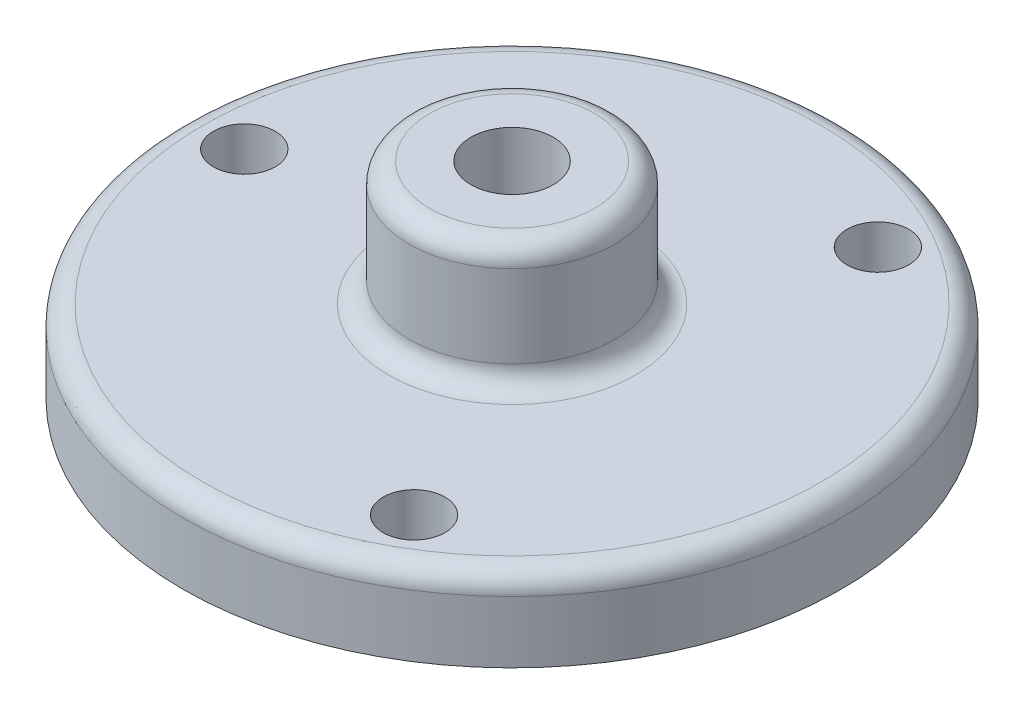
ISO-10303-21;
HEADER;
FILE_DESCRIPTION(('STEP AP214'),'2;1');
FILE_NAME('part.step','',(''),(''),'','','');
FILE_SCHEMA(('AUTOMOTIVE_DESIGN { 1 0 10303 214 1 1 1 1 }'));
ENDSEC;
DATA;
#1=APPLICATION_CONTEXT('core data for automotive mechanical design processes');
#2=APPLICATION_PROTOCOL_DEFINITION('international standard','automotive_design',2000,#1);
#3=PRODUCT_CONTEXT('',#1,'mechanical');
#4=PRODUCT('Part','Part','',(#3));
#5=PRODUCT_RELATED_PRODUCT_CATEGORY('part','',(#4));
#6=PRODUCT_DEFINITION_FORMATION('','',#4);
#7=PRODUCT_DEFINITION_CONTEXT('part definition',#1,'design');
#8=PRODUCT_DEFINITION('design','',#6,#7);
#9=PRODUCT_DEFINITION_SHAPE('','',#8);
#10=(LENGTH_UNIT() NAMED_UNIT(*) SI_UNIT(.MILLI.,.METRE.));
#11=(NAMED_UNIT(*) PLANE_ANGLE_UNIT() SI_UNIT($,.RADIAN.));
#12=(NAMED_UNIT(*) SI_UNIT($,.STERADIAN.) SOLID_ANGLE_UNIT());
#13=UNCERTAINTY_MEASURE_WITH_UNIT(LENGTH_MEASURE(1.E-05),#10,'distance_accuracy_value','');
#14=(GEOMETRIC_REPRESENTATION_CONTEXT(3) GLOBAL_UNCERTAINTY_ASSIGNED_CONTEXT((#13)) GLOBAL_UNIT_ASSIGNED_CONTEXT((#10,
#11,#12)) REPRESENTATION_CONTEXT('',''));
#15=CARTESIAN_POINT('',(0.,0.,0.));
#16=DIRECTION('',(0.,0.,1.));
#17=DIRECTION('',(1.,0.,0.));
#18=AXIS2_PLACEMENT_3D('',#15,#16,#17);
#19=CARTESIAN_POINT('',(0.,4.,0.));
#20=DIRECTION('',(0.,-1.,0.));
#21=DIRECTION('',(0.,0.,-1.));
#22=AXIS2_PLACEMENT_3D('',#19,#20,#21);
#23=CYLINDRICAL_SURFACE('',#22,16.);
#24=CARTESIAN_POINT('',(0.,3.,0.));
#25=DIRECTION('',(0.,1.,0.));
#26=DIRECTION('',(0.,0.,1.));
#27=AXIS2_PLACEMENT_3D('',#24,#25,#26);
#28=CIRCLE('',#27,16.);
#29=CARTESIAN_POINT('',(0.,3.,16.));
#30=VERTEX_POINT('',#29);
#31=EDGE_CURVE('E132',#30,#30,#28,.F.);
#32=ORIENTED_EDGE('',*,*,#31,.T.);
#33=EDGE_LOOP('',(#32));
#34=FACE_BOUND('',#33,.T.);
#35=CARTESIAN_POINT('',(0.,0.,0.));
#36=DIRECTION('',(0.,1.,0.));
#37=DIRECTION('',(0.,0.,1.));
#38=AXIS2_PLACEMENT_3D('',#35,#36,#37);
#39=CIRCLE('',#38,16.);
#40=CARTESIAN_POINT('',(0.,0.,16.));
#41=VERTEX_POINT('',#40);
#42=EDGE_CURVE('E148',#41,#41,#39,.T.);
#43=ORIENTED_EDGE('',*,*,#42,.T.);
#44=EDGE_LOOP('',(#43));
#45=FACE_BOUND('',#44,.T.);
#46=ADVANCED_FACE('F40',(#34,#45),#23,.T.);
#47=CARTESIAN_POINT('',(0.,4.,0.));
#48=DIRECTION('',(0.,1.,0.));
#49=DIRECTION('',(0.,0.,1.));
#50=AXIS2_PLACEMENT_3D('',#47,#48,#49);
#51=PLANE('',#50);
#52=CARTESIAN_POINT('',(0.,4.,0.));
#53=DIRECTION('',(0.,1.,0.));
#54=DIRECTION('',(0.,0.,1.));
#55=AXIS2_PLACEMENT_3D('',#52,#53,#54);
#56=CIRCLE('',#55,15.);
#57=CARTESIAN_POINT('',(0.,4.,15.));
#58=VERTEX_POINT('',#57);
#59=EDGE_CURVE('E140',#58,#58,#56,.T.);
#60=ORIENTED_EDGE('',*,*,#59,.T.);
#61=EDGE_LOOP('',(#60));
#62=FACE_BOUND('',#61,.T.);
#63=CARTESIAN_POINT('',(0.,4.,0.));
#64=DIRECTION('',(0.,1.,0.));
#65=DIRECTION('',(0.,0.,1.));
#66=AXIS2_PLACEMENT_3D('',#63,#64,#65);
#67=CIRCLE('',#66,6.);
#68=CARTESIAN_POINT('',(0.,4.,6.));
#69=VERTEX_POINT('',#68);
#70=EDGE_CURVE('E142',#69,#69,#67,.F.);
#71=ORIENTED_EDGE('',*,*,#70,.T.);
#72=EDGE_LOOP('',(#71));
#73=FACE_BOUND('',#72,.T.);
#74=CARTESIAN_POINT('',(-13.,4.,0.));
#75=DIRECTION('',(0.,1.,0.));
#76=DIRECTION('',(0.,0.,1.));
#77=AXIS2_PLACEMENT_3D('',#74,#75,#76);
#78=CIRCLE('',#77,1.5);
#79=CARTESIAN_POINT('',(-13.,4.,1.5));
#80=VERTEX_POINT('',#79);
#81=EDGE_CURVE('E157',#80,#80,#78,.T.);
#82=ORIENTED_EDGE('',*,*,#81,.F.);
#83=EDGE_LOOP('',(#82));
#84=FACE_BOUND('',#83,.T.);
#85=CARTESIAN_POINT('',(6.50000000000005,4.,-11.2583302491977));
#86=DIRECTION('',(0.,1.,0.));
#87=DIRECTION('',(0.,0.,1.));
#88=AXIS2_PLACEMENT_3D('',#85,#86,#87);
#89=CIRCLE('',#88,1.5);
#90=CARTESIAN_POINT('',(6.50000000000005,4.,-9.75833024919767));
#91=VERTEX_POINT('',#90);
#92=EDGE_CURVE('E156',#91,#91,#89,.T.);
#93=ORIENTED_EDGE('',*,*,#92,.F.);
#94=EDGE_LOOP('',(#93));
#95=FACE_BOUND('',#94,.T.);
#96=CARTESIAN_POINT('',(6.49999999999989,4.,11.2583302491978));
#97=DIRECTION('',(0.,1.,0.));
#98=DIRECTION('',(0.,0.,1.));
#99=AXIS2_PLACEMENT_3D('',#96,#97,#98);
#100=CIRCLE('',#99,1.5);
#101=CARTESIAN_POINT('',(6.49999999999989,4.,12.7583302491978));
#102=VERTEX_POINT('',#101);
#103=EDGE_CURVE('E147',#102,#102,#100,.T.);
#104=ORIENTED_EDGE('',*,*,#103,.F.);
#105=EDGE_LOOP('',(#104));
#106=FACE_BOUND('',#105,.T.);
#107=ADVANCED_FACE('F114',(#62,#73,#84,#95,#106),#51,.T.);
#108=CARTESIAN_POINT('',(0.,0.,0.));
#109=DIRECTION('',(0.,1.,0.));
#110=DIRECTION('',(0.,0.,1.));
#111=AXIS2_PLACEMENT_3D('',#108,#109,#110);
#112=PLANE('',#111);
#113=CARTESIAN_POINT('',(0.,0.,0.));
#114=DIRECTION('',(0.,-1.,0.));
#115=DIRECTION('',(0.,0.,-1.));
#116=AXIS2_PLACEMENT_3D('',#113,#114,#115);
#117=CIRCLE('',#116,8.);
#118=CARTESIAN_POINT('',(0.,0.,-8.));
#119=VERTEX_POINT('',#118);
#120=EDGE_CURVE('E144',#119,#119,#117,.T.);
#121=ORIENTED_EDGE('',*,*,#120,.F.);
#122=EDGE_LOOP('',(#121));
#123=FACE_BOUND('',#122,.T.);
#124=CARTESIAN_POINT('',(-13.,0.,0.));
#125=DIRECTION('',(0.,1.,0.));
#126=DIRECTION('',(0.,0.,1.));
#127=AXIS2_PLACEMENT_3D('',#124,#125,#126);
#128=CIRCLE('',#127,1.5);
#129=CARTESIAN_POINT('',(-13.,0.,1.5));
#130=VERTEX_POINT('',#129);
#131=EDGE_CURVE('E149',#130,#130,#128,.F.);
#132=ORIENTED_EDGE('',*,*,#131,.F.);
#133=EDGE_LOOP('',(#132));
#134=FACE_BOUND('',#133,.T.);
#135=CARTESIAN_POINT('',(6.50000000000005,0.,-11.2583302491977));
#136=DIRECTION('',(0.,1.,0.));
#137=DIRECTION('',(0.,0.,1.));
#138=AXIS2_PLACEMENT_3D('',#135,#136,#137);
#139=CIRCLE('',#138,1.5);
#140=CARTESIAN_POINT('',(6.50000000000005,0.,-9.75833024919767));
#141=VERTEX_POINT('',#140);
#142=EDGE_CURVE('E153',#141,#141,#139,.F.);
#143=ORIENTED_EDGE('',*,*,#142,.F.);
#144=EDGE_LOOP('',(#143));
#145=FACE_BOUND('',#144,.T.);
#146=CARTESIAN_POINT('',(6.49999999999989,0.,11.2583302491978));
#147=DIRECTION('',(0.,1.,0.));
#148=DIRECTION('',(0.,0.,1.));
#149=AXIS2_PLACEMENT_3D('',#146,#147,#148);
#150=CIRCLE('',#149,1.5);
#151=CARTESIAN_POINT('',(6.49999999999989,0.,12.7583302491978));
#152=VERTEX_POINT('',#151);
#153=EDGE_CURVE('E69',#152,#152,#150,.F.);
#154=ORIENTED_EDGE('',*,*,#153,.F.);
#155=EDGE_LOOP('',(#154));
#156=FACE_BOUND('',#155,.T.);
#157=ORIENTED_EDGE('',*,*,#42,.F.);
#158=EDGE_LOOP('',(#157));
#159=FACE_BOUND('',#158,.T.);
#160=ADVANCED_FACE('F115',(#123,#134,#145,#156,#159),#112,.F.);
#161=CARTESIAN_POINT('',(0.,10.,0.));
#162=DIRECTION('',(0.,-1.,0.));
#163=DIRECTION('',(0.,0.,-1.));
#164=AXIS2_PLACEMENT_3D('',#161,#162,#163);
#165=CYLINDRICAL_SURFACE('',#164,5.);
#166=CARTESIAN_POINT('',(0.,9.,0.));
#167=DIRECTION('',(0.,1.,0.));
#168=DIRECTION('',(0.,0.,1.));
#169=AXIS2_PLACEMENT_3D('',#166,#167,#168);
#170=CIRCLE('',#169,5.);
#171=CARTESIAN_POINT('',(0.,9.,5.));
#172=VERTEX_POINT('',#171);
#173=EDGE_CURVE('E10',#172,#172,#170,.F.);
#174=ORIENTED_EDGE('',*,*,#173,.T.);
#175=EDGE_LOOP('',(#174));
#176=FACE_BOUND('',#175,.T.);
#177=CARTESIAN_POINT('',(0.,5.,0.));
#178=DIRECTION('',(0.,1.,0.));
#179=DIRECTION('',(0.,0.,1.));
#180=AXIS2_PLACEMENT_3D('',#177,#178,#179);
#181=CIRCLE('',#180,5.);
#182=CARTESIAN_POINT('',(0.,5.,5.));
#183=VERTEX_POINT('',#182);
#184=EDGE_CURVE('E50',#183,#183,#181,.T.);
#185=ORIENTED_EDGE('',*,*,#184,.T.);
#186=EDGE_LOOP('',(#185));
#187=FACE_BOUND('',#186,.T.);
#188=ADVANCED_FACE('F108',(#176,#187),#165,.T.);
#189=CARTESIAN_POINT('',(0.,10.,0.));
#190=DIRECTION('',(0.,1.,0.));
#191=DIRECTION('',(0.,0.,1.));
#192=AXIS2_PLACEMENT_3D('',#189,#190,#191);
#193=PLANE('',#192);
#194=CARTESIAN_POINT('',(0.,10.000012,0.));
#195=DIRECTION('',(0.,1.,0.));
#196=DIRECTION('',(0.,0.,1.));
#197=AXIS2_PLACEMENT_3D('',#194,#195,#196);
#198=CIRCLE('',#197,2.);
#199=CARTESIAN_POINT('',(0.,10.000012,2.));
#200=VERTEX_POINT('',#199);
#201=EDGE_CURVE('E59',#200,#200,#198,.T.);
#202=ORIENTED_EDGE('',*,*,#201,.F.);
#203=EDGE_LOOP('',(#202));
#204=FACE_BOUND('',#203,.T.);
#205=CARTESIAN_POINT('',(0.,10.,0.));
#206=DIRECTION('',(0.,1.,0.));
#207=DIRECTION('',(0.,0.,1.));
#208=AXIS2_PLACEMENT_3D('',#205,#206,#207);
#209=CIRCLE('',#208,4.);
#210=CARTESIAN_POINT('',(0.,10.,4.));
#211=VERTEX_POINT('',#210);
#212=EDGE_CURVE('E55',#211,#211,#209,.T.);
#213=ORIENTED_EDGE('',*,*,#212,.T.);
#214=EDGE_LOOP('',(#213));
#215=FACE_BOUND('',#214,.T.);
#216=ADVANCED_FACE('F56',(#204,#215),#193,.T.);
#217=CARTESIAN_POINT('',(6.49999999999989,-0.00100000000000013,11.2583302491978));
#218=DIRECTION('',(0.,1.,0.));
#219=DIRECTION('',(0.,0.,1.));
#220=AXIS2_PLACEMENT_3D('',#217,#218,#219);
#221=CYLINDRICAL_SURFACE('',#220,1.5);
#222=ORIENTED_EDGE('',*,*,#103,.T.);
#223=EDGE_LOOP('',(#222));
#224=FACE_BOUND('',#223,.T.);
#225=ORIENTED_EDGE('',*,*,#153,.T.);
#226=EDGE_LOOP('',(#225));
#227=FACE_BOUND('',#226,.T.);
#228=ADVANCED_FACE('F105',(#224,#227),#221,.F.);
#229=CARTESIAN_POINT('',(6.50000000000005,-0.00100000000000013,-11.2583302491977));
#230=DIRECTION('',(0.,1.,0.));
#231=DIRECTION('',(0.,0.,1.));
#232=AXIS2_PLACEMENT_3D('',#229,#230,#231);
#233=CYLINDRICAL_SURFACE('',#232,1.5);
#234=ORIENTED_EDGE('',*,*,#92,.T.);
#235=EDGE_LOOP('',(#234));
#236=FACE_BOUND('',#235,.T.);
#237=ORIENTED_EDGE('',*,*,#142,.T.);
#238=EDGE_LOOP('',(#237));
#239=FACE_BOUND('',#238,.T.);
#240=ADVANCED_FACE('F98',(#236,#239),#233,.F.);
#241=CARTESIAN_POINT('',(-13.,-0.00100000000000013,0.));
#242=DIRECTION('',(0.,1.,0.));
#243=DIRECTION('',(0.,0.,1.));
#244=AXIS2_PLACEMENT_3D('',#241,#242,#243);
#245=CYLINDRICAL_SURFACE('',#244,1.5);
#246=ORIENTED_EDGE('',*,*,#81,.T.);
#247=EDGE_LOOP('',(#246));
#248=FACE_BOUND('',#247,.T.);
#249=ORIENTED_EDGE('',*,*,#131,.T.);
#250=EDGE_LOOP('',(#249));
#251=FACE_BOUND('',#250,.T.);
#252=ADVANCED_FACE('F94',(#248,#251),#245,.F.);
#253=CARTESIAN_POINT('',(0.,-1.,0.));
#254=DIRECTION('',(0.,1.,0.));
#255=DIRECTION('',(0.,0.,1.));
#256=AXIS2_PLACEMENT_3D('',#253,#254,#255);
#257=CYLINDRICAL_SURFACE('',#256,8.);
#258=CARTESIAN_POINT('',(0.,-1.,0.));
#259=DIRECTION('',(0.,-1.,0.));
#260=DIRECTION('',(0.,0.,-1.));
#261=AXIS2_PLACEMENT_3D('',#258,#259,#260);
#262=CIRCLE('',#261,8.);
#263=CARTESIAN_POINT('',(0.,-1.,-8.));
#264=VERTEX_POINT('',#263);
#265=EDGE_CURVE('E62',#264,#264,#262,.T.);
#266=ORIENTED_EDGE('',*,*,#265,.F.);
#267=EDGE_LOOP('',(#266));
#268=FACE_BOUND('',#267,.T.);
#269=ORIENTED_EDGE('',*,*,#120,.T.);
#270=EDGE_LOOP('',(#269));
#271=FACE_BOUND('',#270,.T.);
#272=ADVANCED_FACE('F93',(#268,#271),#257,.T.);
#273=CARTESIAN_POINT('',(0.,-1.,0.));
#274=DIRECTION('',(0.,-1.,0.));
#275=DIRECTION('',(0.,0.,-1.));
#276=AXIS2_PLACEMENT_3D('',#273,#274,#275);
#277=PLANE('',#276);
#278=CARTESIAN_POINT('',(0.,-0.999999999999999,0.));
#279=DIRECTION('',(0.,1.,0.));
#280=DIRECTION('',(0.,0.,1.));
#281=AXIS2_PLACEMENT_3D('',#278,#279,#280);
#282=CIRCLE('',#281,2.);
#283=CARTESIAN_POINT('',(0.,-0.999999999999999,2.));
#284=VERTEX_POINT('',#283);
#285=EDGE_CURVE('E65',#284,#284,#282,.T.);
#286=ORIENTED_EDGE('',*,*,#285,.T.);
#287=EDGE_LOOP('',(#286));
#288=FACE_BOUND('',#287,.T.);
#289=ORIENTED_EDGE('',*,*,#265,.T.);
#290=EDGE_LOOP('',(#289));
#291=FACE_BOUND('',#290,.T.);
#292=ADVANCED_FACE('F87',(#288,#291),#277,.T.);
#293=CARTESIAN_POINT('',(0.,3.,0.));
#294=DIRECTION('',(0.,1.,0.));
#295=DIRECTION('',(0.,0.,1.));
#296=AXIS2_PLACEMENT_3D('',#293,#294,#295);
#297=TOROIDAL_SURFACE('',#296,15.,1.);
#298=ORIENTED_EDGE('',*,*,#31,.F.);
#299=EDGE_LOOP('',(#298));
#300=FACE_BOUND('',#299,.T.);
#301=ORIENTED_EDGE('',*,*,#59,.F.);
#302=EDGE_LOOP('',(#301));
#303=FACE_BOUND('',#302,.T.);
#304=ADVANCED_FACE('F89',(#300,#303),#297,.T.);
#305=CARTESIAN_POINT('',(0.,9.,0.));
#306=DIRECTION('',(0.,1.,0.));
#307=DIRECTION('',(0.,0.,1.));
#308=AXIS2_PLACEMENT_3D('',#305,#306,#307);
#309=TOROIDAL_SURFACE('',#308,4.,1.);
#310=ORIENTED_EDGE('',*,*,#173,.F.);
#311=EDGE_LOOP('',(#310));
#312=FACE_BOUND('',#311,.T.);
#313=ORIENTED_EDGE('',*,*,#212,.F.);
#314=EDGE_LOOP('',(#313));
#315=FACE_BOUND('',#314,.T.);
#316=ADVANCED_FACE('F123',(#312,#315),#309,.T.);
#317=CARTESIAN_POINT('',(0.,5.,0.));
#318=DIRECTION('',(0.,1.,0.));
#319=DIRECTION('',(0.,0.,1.));
#320=AXIS2_PLACEMENT_3D('',#317,#318,#319);
#321=TOROIDAL_SURFACE('',#320,6.,1.);
#322=ORIENTED_EDGE('',*,*,#70,.F.);
#323=EDGE_LOOP('',(#322));
#324=FACE_BOUND('',#323,.T.);
#325=ORIENTED_EDGE('',*,*,#184,.F.);
#326=EDGE_LOOP('',(#325));
#327=FACE_BOUND('',#326,.T.);
#328=ADVANCED_FACE('F39',(#324,#327),#321,.F.);
#329=CARTESIAN_POINT('',(0.,-0.999999999999999,0.));
#330=DIRECTION('',(0.,1.,0.));
#331=DIRECTION('',(0.,0.,1.));
#332=AXIS2_PLACEMENT_3D('',#329,#330,#331);
#333=CYLINDRICAL_SURFACE('',#332,2.);
#334=ORIENTED_EDGE('',*,*,#285,.F.);
#335=EDGE_LOOP('',(#334));
#336=FACE_BOUND('',#335,.T.);
#337=ORIENTED_EDGE('',*,*,#201,.T.);
#338=EDGE_LOOP('',(#337));
#339=FACE_BOUND('',#338,.T.);
#340=ADVANCED_FACE('F76',(#336,#339),#333,.F.);
#341=CLOSED_SHELL('',(#46,#107,#160,#188,#216,#228,#240,#252,#272,#292,#304,#316,#328,#340));
#342=MANIFOLD_SOLID_BREP('B2',#341);
#343=ADVANCED_BREP_SHAPE_REPRESENTATION('',(#18,#342),#14);
#344=SHAPE_DEFINITION_REPRESENTATION(#9,#343);
ENDSEC;
END-ISO-10303-21;
